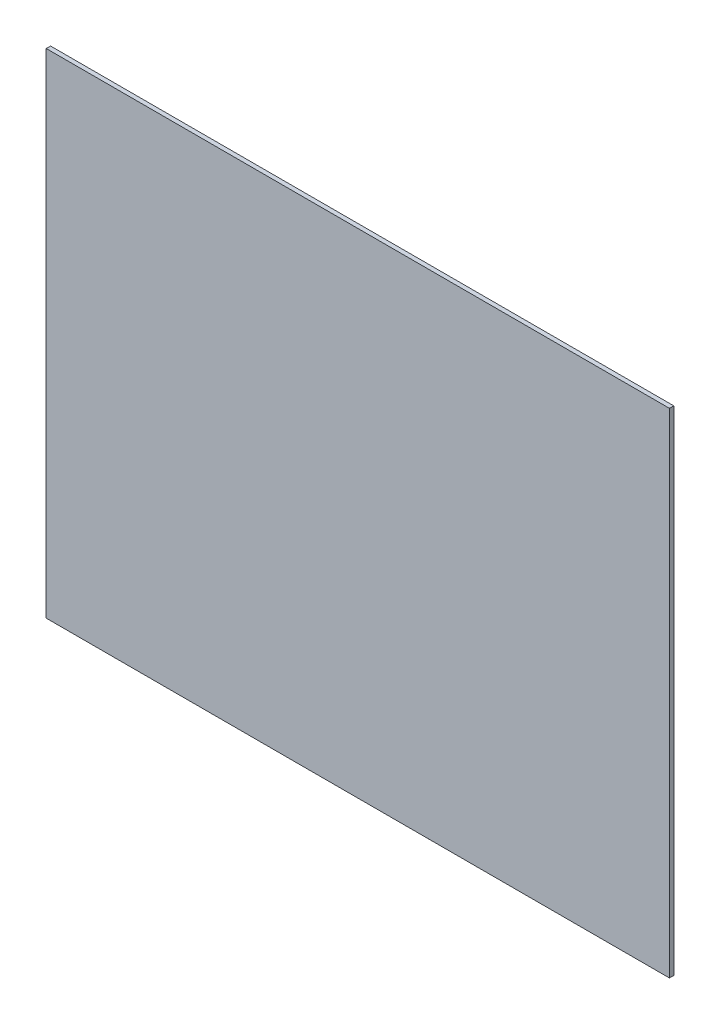
ISO-10303-21;
HEADER;
FILE_DESCRIPTION(('STEP AP214'),'2;1');
FILE_NAME('part.step','',(''),(''),'','','');
FILE_SCHEMA(('AUTOMOTIVE_DESIGN { 1 0 10303 214 1 1 1 1 }'));
ENDSEC;
DATA;
#1=APPLICATION_CONTEXT('core data for automotive mechanical design processes');
#2=APPLICATION_PROTOCOL_DEFINITION('international standard','automotive_design',2000,#1);
#3=PRODUCT_CONTEXT('',#1,'mechanical');
#4=PRODUCT('Part','Part','',(#3));
#5=PRODUCT_RELATED_PRODUCT_CATEGORY('part','',(#4));
#6=PRODUCT_DEFINITION_FORMATION('','',#4);
#7=PRODUCT_DEFINITION_CONTEXT('part definition',#1,'design');
#8=PRODUCT_DEFINITION('design','',#6,#7);
#9=PRODUCT_DEFINITION_SHAPE('','',#8);
#10=(LENGTH_UNIT() NAMED_UNIT(*) SI_UNIT(.MILLI.,.METRE.));
#11=(NAMED_UNIT(*) PLANE_ANGLE_UNIT() SI_UNIT($,.RADIAN.));
#12=(NAMED_UNIT(*) SI_UNIT($,.STERADIAN.) SOLID_ANGLE_UNIT());
#13=UNCERTAINTY_MEASURE_WITH_UNIT(LENGTH_MEASURE(1.E-05),#10,'distance_accuracy_value','');
#14=(GEOMETRIC_REPRESENTATION_CONTEXT(3) GLOBAL_UNCERTAINTY_ASSIGNED_CONTEXT((#13)) GLOBAL_UNIT_ASSIGNED_CONTEXT((#10,
#11,#12)) REPRESENTATION_CONTEXT('',''));
#15=CARTESIAN_POINT('',(0.,0.,0.));
#16=DIRECTION('',(0.,0.,1.));
#17=DIRECTION('',(1.,0.,0.));
#18=AXIS2_PLACEMENT_3D('',#15,#16,#17);
#19=CARTESIAN_POINT('',(0.,0.,3.175));
#20=DIRECTION('',(1.,0.,0.));
#21=DIRECTION('',(0.,0.,-1.));
#22=AXIS2_PLACEMENT_3D('',#19,#20,#21);
#23=PLANE('',#22);
#24=DIRECTION('',(0.,-1.,0.));
#25=VECTOR('',#24,1.);
#26=CARTESIAN_POINT('',(0.,0.,0.));
#27=LINE('',#26,#25);
#28=CARTESIAN_POINT('',(0.,361.95,0.));
#29=VERTEX_POINT('',#28);
#30=CARTESIAN_POINT('',(0.,0.,0.));
#31=VERTEX_POINT('',#30);
#32=EDGE_CURVE('E96',#29,#31,#27,.T.);
#33=ORIENTED_EDGE('',*,*,#32,.T.);
#34=DIRECTION('',(0.,0.,-1.));
#35=VECTOR('',#34,1.);
#36=CARTESIAN_POINT('',(0.,0.,3.175));
#37=LINE('',#36,#35);
#38=CARTESIAN_POINT('',(0.,0.,3.175));
#39=VERTEX_POINT('',#38);
#40=EDGE_CURVE('E11',#39,#31,#37,.T.);
#41=ORIENTED_EDGE('',*,*,#40,.F.);
#42=DIRECTION('',(0.,-1.,0.));
#43=VECTOR('',#42,1.);
#44=CARTESIAN_POINT('',(0.,0.,3.175));
#45=LINE('',#44,#43);
#46=CARTESIAN_POINT('',(0.,361.95,3.175));
#47=VERTEX_POINT('',#46);
#48=EDGE_CURVE('E84',#47,#39,#45,.T.);
#49=ORIENTED_EDGE('',*,*,#48,.F.);
#50=DIRECTION('',(0.,0.,-1.));
#51=VECTOR('',#50,1.);
#52=CARTESIAN_POINT('',(0.,361.95,3.175));
#53=LINE('',#52,#51);
#54=EDGE_CURVE('E92',#47,#29,#53,.T.);
#55=ORIENTED_EDGE('',*,*,#54,.T.);
#56=EDGE_LOOP('',(#33,#41,#49,#55));
#57=FACE_BOUND('',#56,.T.);
#58=ADVANCED_FACE('F33',(#57),#23,.F.);
#59=CARTESIAN_POINT('',(0.,0.,3.175));
#60=DIRECTION('',(0.,1.,0.));
#61=DIRECTION('',(0.,0.,1.));
#62=AXIS2_PLACEMENT_3D('',#59,#60,#61);
#63=PLANE('',#62);
#64=DIRECTION('',(1.,0.,0.));
#65=VECTOR('',#64,1.);
#66=CARTESIAN_POINT('',(0.,0.,0.));
#67=LINE('',#66,#65);
#68=CARTESIAN_POINT('',(457.2,0.,0.));
#69=VERTEX_POINT('',#68);
#70=EDGE_CURVE('E88',#31,#69,#67,.T.);
#71=ORIENTED_EDGE('',*,*,#70,.T.);
#72=DIRECTION('',(0.,0.,-1.));
#73=VECTOR('',#72,1.);
#74=CARTESIAN_POINT('',(457.2,0.,3.175));
#75=LINE('',#74,#73);
#76=CARTESIAN_POINT('',(457.2,0.,3.175));
#77=VERTEX_POINT('',#76);
#78=EDGE_CURVE('E41',#77,#69,#75,.T.);
#79=ORIENTED_EDGE('',*,*,#78,.F.);
#80=DIRECTION('',(1.,0.,0.));
#81=VECTOR('',#80,1.);
#82=CARTESIAN_POINT('',(0.,0.,3.175));
#83=LINE('',#82,#81);
#84=EDGE_CURVE('E79',#39,#77,#83,.T.);
#85=ORIENTED_EDGE('',*,*,#84,.F.);
#86=ORIENTED_EDGE('',*,*,#40,.T.);
#87=EDGE_LOOP('',(#71,#79,#85,#86));
#88=FACE_BOUND('',#87,.T.);
#89=ADVANCED_FACE('F87',(#88),#63,.F.);
#90=CARTESIAN_POINT('',(457.2,0.,3.175));
#91=DIRECTION('',(-1.,0.,0.));
#92=DIRECTION('',(0.,0.,1.));
#93=AXIS2_PLACEMENT_3D('',#90,#91,#92);
#94=PLANE('',#93);
#95=DIRECTION('',(0.,1.,0.));
#96=VECTOR('',#95,1.);
#97=CARTESIAN_POINT('',(457.2,0.,0.));
#98=LINE('',#97,#96);
#99=CARTESIAN_POINT('',(457.2,361.95,0.));
#100=VERTEX_POINT('',#99);
#101=EDGE_CURVE('E66',#69,#100,#98,.T.);
#102=ORIENTED_EDGE('',*,*,#101,.T.);
#103=DIRECTION('',(0.,0.,-1.));
#104=VECTOR('',#103,1.);
#105=CARTESIAN_POINT('',(457.2,361.95,3.175));
#106=LINE('',#105,#104);
#107=CARTESIAN_POINT('',(457.2,361.95,3.175));
#108=VERTEX_POINT('',#107);
#109=EDGE_CURVE('E89',#108,#100,#106,.T.);
#110=ORIENTED_EDGE('',*,*,#109,.F.);
#111=DIRECTION('',(0.,1.,0.));
#112=VECTOR('',#111,1.);
#113=CARTESIAN_POINT('',(457.2,0.,3.175));
#114=LINE('',#113,#112);
#115=EDGE_CURVE('E82',#77,#108,#114,.T.);
#116=ORIENTED_EDGE('',*,*,#115,.F.);
#117=ORIENTED_EDGE('',*,*,#78,.T.);
#118=EDGE_LOOP('',(#102,#110,#116,#117));
#119=FACE_BOUND('',#118,.T.);
#120=ADVANCED_FACE('F90',(#119),#94,.F.);
#121=CARTESIAN_POINT('',(0.,361.95,3.175));
#122=DIRECTION('',(0.,-1.,0.));
#123=DIRECTION('',(0.,0.,-1.));
#124=AXIS2_PLACEMENT_3D('',#121,#122,#123);
#125=PLANE('',#124);
#126=DIRECTION('',(-1.,0.,0.));
#127=VECTOR('',#126,1.);
#128=CARTESIAN_POINT('',(0.,361.95,0.));
#129=LINE('',#128,#127);
#130=EDGE_CURVE('E72',#100,#29,#129,.T.);
#131=ORIENTED_EDGE('',*,*,#130,.T.);
#132=ORIENTED_EDGE('',*,*,#54,.F.);
#133=DIRECTION('',(-1.,0.,0.));
#134=VECTOR('',#133,1.);
#135=CARTESIAN_POINT('',(0.,361.95,3.175));
#136=LINE('',#135,#134);
#137=EDGE_CURVE('E49',#108,#47,#136,.T.);
#138=ORIENTED_EDGE('',*,*,#137,.F.);
#139=ORIENTED_EDGE('',*,*,#109,.T.);
#140=EDGE_LOOP('',(#131,#132,#138,#139));
#141=FACE_BOUND('',#140,.T.);
#142=ADVANCED_FACE('F103',(#141),#125,.F.);
#143=CARTESIAN_POINT('',(0.,0.,3.175));
#144=DIRECTION('',(0.,0.,-1.));
#145=DIRECTION('',(-1.,0.,0.));
#146=AXIS2_PLACEMENT_3D('',#143,#144,#145);
#147=PLANE('',#146);
#148=ORIENTED_EDGE('',*,*,#48,.T.);
#149=ORIENTED_EDGE('',*,*,#84,.T.);
#150=ORIENTED_EDGE('',*,*,#115,.T.);
#151=ORIENTED_EDGE('',*,*,#137,.T.);
#152=EDGE_LOOP('',(#148,#149,#150,#151));
#153=FACE_BOUND('',#152,.T.);
#154=ADVANCED_FACE('F80',(#153),#147,.F.);
#155=CARTESIAN_POINT('',(0.,0.,0.));
#156=DIRECTION('',(0.,0.,-1.));
#157=DIRECTION('',(-1.,0.,0.));
#158=AXIS2_PLACEMENT_3D('',#155,#156,#157);
#159=PLANE('',#158);
#160=ORIENTED_EDGE('',*,*,#32,.F.);
#161=ORIENTED_EDGE('',*,*,#130,.F.);
#162=ORIENTED_EDGE('',*,*,#101,.F.);
#163=ORIENTED_EDGE('',*,*,#70,.F.);
#164=EDGE_LOOP('',(#160,#161,#162,#163));
#165=FACE_BOUND('',#164,.T.);
#166=ADVANCED_FACE('F106',(#165),#159,.T.);
#167=CLOSED_SHELL('',(#58,#89,#120,#142,#154,#166));
#168=MANIFOLD_SOLID_BREP('B2',#167);
#169=ADVANCED_BREP_SHAPE_REPRESENTATION('',(#18,#168),#14);
#170=SHAPE_DEFINITION_REPRESENTATION(#9,#169);
ENDSEC;
END-ISO-10303-21;
